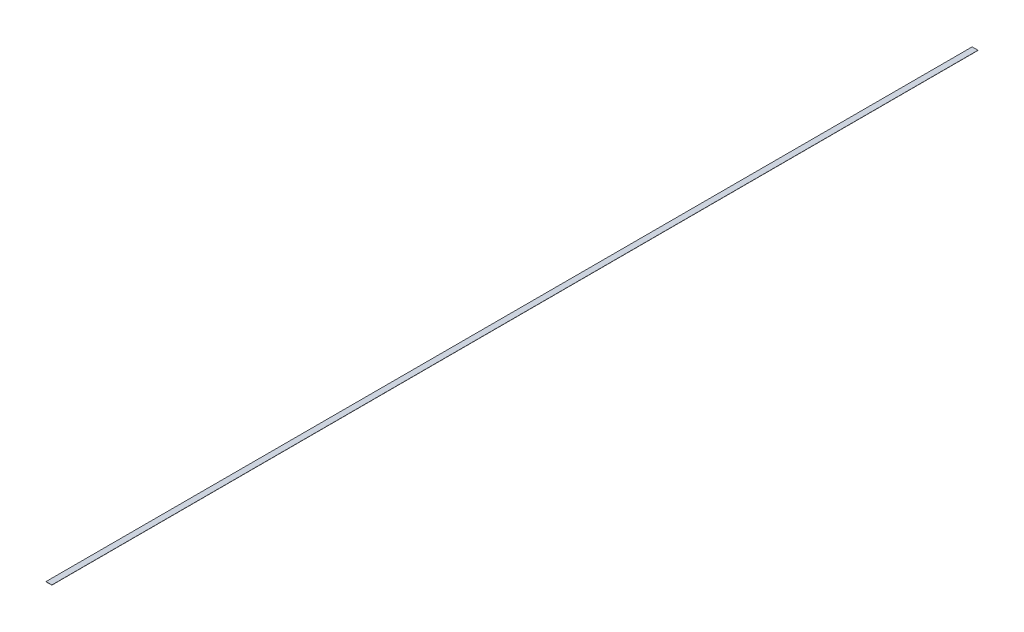
ISO-10303-21;
HEADER;
FILE_DESCRIPTION(('STEP AP214'),'2;1');
FILE_NAME('part.step','',(''),(''),'','','');
FILE_SCHEMA(('AUTOMOTIVE_DESIGN { 1 0 10303 214 1 1 1 1 }'));
ENDSEC;
DATA;
#1=APPLICATION_CONTEXT('core data for automotive mechanical design processes');
#2=APPLICATION_PROTOCOL_DEFINITION('international standard','automotive_design',2000,#1);
#3=PRODUCT_CONTEXT('',#1,'mechanical');
#4=PRODUCT('Part','Part','',(#3));
#5=PRODUCT_RELATED_PRODUCT_CATEGORY('part','',(#4));
#6=PRODUCT_DEFINITION_FORMATION('','',#4);
#7=PRODUCT_DEFINITION_CONTEXT('part definition',#1,'design');
#8=PRODUCT_DEFINITION('design','',#6,#7);
#9=PRODUCT_DEFINITION_SHAPE('','',#8);
#10=(LENGTH_UNIT() NAMED_UNIT(*) SI_UNIT(.MILLI.,.METRE.));
#11=(NAMED_UNIT(*) PLANE_ANGLE_UNIT() SI_UNIT($,.RADIAN.));
#12=(NAMED_UNIT(*) SI_UNIT($,.STERADIAN.) SOLID_ANGLE_UNIT());
#13=UNCERTAINTY_MEASURE_WITH_UNIT(LENGTH_MEASURE(1.E-05),#10,'distance_accuracy_value','');
#14=(GEOMETRIC_REPRESENTATION_CONTEXT(3) GLOBAL_UNCERTAINTY_ASSIGNED_CONTEXT((#13)) GLOBAL_UNIT_ASSIGNED_CONTEXT((#10,
#11,#12)) REPRESENTATION_CONTEXT('',''));
#15=CARTESIAN_POINT('',(0.,0.,0.));
#16=DIRECTION('',(0.,0.,1.));
#17=DIRECTION('',(1.,0.,0.));
#18=AXIS2_PLACEMENT_3D('',#15,#16,#17);
#19=CARTESIAN_POINT('',(25.4,1.5875,-4008.755));
#20=DIRECTION('',(-1.,0.,0.));
#21=DIRECTION('',(0.,0.,1.));
#22=AXIS2_PLACEMENT_3D('',#19,#20,#21);
#23=PLANE('',#22);
#24=DIRECTION('',(0.,0.,-1.));
#25=VECTOR('',#24,1.);
#26=CARTESIAN_POINT('',(25.4,0.,-4008.755));
#27=LINE('',#26,#25);
#28=CARTESIAN_POINT('',(25.4,0.,4008.755));
#29=VERTEX_POINT('',#28);
#30=CARTESIAN_POINT('',(25.4,0.,-4008.755));
#31=VERTEX_POINT('',#30);
#32=EDGE_CURVE('E97',#29,#31,#27,.T.);
#33=ORIENTED_EDGE('',*,*,#32,.T.);
#34=DIRECTION('',(0.,-1.,0.));
#35=VECTOR('',#34,1.);
#36=CARTESIAN_POINT('',(25.4,1.5875,-4008.755));
#37=LINE('',#36,#35);
#38=CARTESIAN_POINT('',(25.4,1.5875,-4008.755));
#39=VERTEX_POINT('',#38);
#40=EDGE_CURVE('E11',#39,#31,#37,.T.);
#41=ORIENTED_EDGE('',*,*,#40,.F.);
#42=DIRECTION('',(0.,0.,-1.));
#43=VECTOR('',#42,1.);
#44=CARTESIAN_POINT('',(25.4,1.5875,-4008.755));
#45=LINE('',#44,#43);
#46=CARTESIAN_POINT('',(25.4,1.5875,4008.755));
#47=VERTEX_POINT('',#46);
#48=EDGE_CURVE('E85',#47,#39,#45,.T.);
#49=ORIENTED_EDGE('',*,*,#48,.F.);
#50=DIRECTION('',(0.,-1.,0.));
#51=VECTOR('',#50,1.);
#52=CARTESIAN_POINT('',(25.4,1.5875,4008.755));
#53=LINE('',#52,#51);
#54=EDGE_CURVE('E93',#47,#29,#53,.T.);
#55=ORIENTED_EDGE('',*,*,#54,.T.);
#56=EDGE_LOOP('',(#33,#41,#49,#55));
#57=FACE_BOUND('',#56,.T.);
#58=ADVANCED_FACE('F34',(#57),#23,.F.);
#59=CARTESIAN_POINT('',(-25.4,1.5875,-4008.755));
#60=DIRECTION('',(0.,0.,1.));
#61=DIRECTION('',(1.,0.,0.));
#62=AXIS2_PLACEMENT_3D('',#59,#60,#61);
#63=PLANE('',#62);
#64=DIRECTION('',(-1.,0.,0.));
#65=VECTOR('',#64,1.);
#66=CARTESIAN_POINT('',(-25.4,0.,-4008.755));
#67=LINE('',#66,#65);
#68=CARTESIAN_POINT('',(-25.4,0.,-4008.755));
#69=VERTEX_POINT('',#68);
#70=EDGE_CURVE('E89',#31,#69,#67,.T.);
#71=ORIENTED_EDGE('',*,*,#70,.T.);
#72=DIRECTION('',(0.,-1.,0.));
#73=VECTOR('',#72,1.);
#74=CARTESIAN_POINT('',(-25.4,1.5875,-4008.755));
#75=LINE('',#74,#73);
#76=CARTESIAN_POINT('',(-25.4,1.5875,-4008.755));
#77=VERTEX_POINT('',#76);
#78=EDGE_CURVE('E42',#77,#69,#75,.T.);
#79=ORIENTED_EDGE('',*,*,#78,.F.);
#80=DIRECTION('',(-1.,0.,0.));
#81=VECTOR('',#80,1.);
#82=CARTESIAN_POINT('',(-25.4,1.5875,-4008.755));
#83=LINE('',#82,#81);
#84=EDGE_CURVE('E80',#39,#77,#83,.T.);
#85=ORIENTED_EDGE('',*,*,#84,.F.);
#86=ORIENTED_EDGE('',*,*,#40,.T.);
#87=EDGE_LOOP('',(#71,#79,#85,#86));
#88=FACE_BOUND('',#87,.T.);
#89=ADVANCED_FACE('F88',(#88),#63,.F.);
#90=CARTESIAN_POINT('',(-25.4,1.5875,-4008.755));
#91=DIRECTION('',(1.,0.,0.));
#92=DIRECTION('',(0.,0.,-1.));
#93=AXIS2_PLACEMENT_3D('',#90,#91,#92);
#94=PLANE('',#93);
#95=DIRECTION('',(0.,0.,1.));
#96=VECTOR('',#95,1.);
#97=CARTESIAN_POINT('',(-25.4,0.,-4008.755));
#98=LINE('',#97,#96);
#99=CARTESIAN_POINT('',(-25.4,0.,4008.755));
#100=VERTEX_POINT('',#99);
#101=EDGE_CURVE('E67',#69,#100,#98,.T.);
#102=ORIENTED_EDGE('',*,*,#101,.T.);
#103=DIRECTION('',(0.,-1.,0.));
#104=VECTOR('',#103,1.);
#105=CARTESIAN_POINT('',(-25.4,1.5875,4008.755));
#106=LINE('',#105,#104);
#107=CARTESIAN_POINT('',(-25.4,1.5875,4008.755));
#108=VERTEX_POINT('',#107);
#109=EDGE_CURVE('E90',#108,#100,#106,.T.);
#110=ORIENTED_EDGE('',*,*,#109,.F.);
#111=DIRECTION('',(0.,0.,1.));
#112=VECTOR('',#111,1.);
#113=CARTESIAN_POINT('',(-25.4,1.5875,-4008.755));
#114=LINE('',#113,#112);
#115=EDGE_CURVE('E83',#77,#108,#114,.T.);
#116=ORIENTED_EDGE('',*,*,#115,.F.);
#117=ORIENTED_EDGE('',*,*,#78,.T.);
#118=EDGE_LOOP('',(#102,#110,#116,#117));
#119=FACE_BOUND('',#118,.T.);
#120=ADVANCED_FACE('F91',(#119),#94,.F.);
#121=CARTESIAN_POINT('',(-25.4,1.5875,4008.755));
#122=DIRECTION('',(0.,0.,-1.));
#123=DIRECTION('',(-1.,0.,0.));
#124=AXIS2_PLACEMENT_3D('',#121,#122,#123);
#125=PLANE('',#124);
#126=DIRECTION('',(1.,0.,0.));
#127=VECTOR('',#126,1.);
#128=CARTESIAN_POINT('',(-25.4,0.,4008.755));
#129=LINE('',#128,#127);
#130=EDGE_CURVE('E73',#100,#29,#129,.T.);
#131=ORIENTED_EDGE('',*,*,#130,.T.);
#132=ORIENTED_EDGE('',*,*,#54,.F.);
#133=DIRECTION('',(1.,0.,0.));
#134=VECTOR('',#133,1.);
#135=CARTESIAN_POINT('',(-25.4,1.5875,4008.755));
#136=LINE('',#135,#134);
#137=EDGE_CURVE('E50',#108,#47,#136,.T.);
#138=ORIENTED_EDGE('',*,*,#137,.F.);
#139=ORIENTED_EDGE('',*,*,#109,.T.);
#140=EDGE_LOOP('',(#131,#132,#138,#139));
#141=FACE_BOUND('',#140,.T.);
#142=ADVANCED_FACE('F104',(#141),#125,.F.);
#143=CARTESIAN_POINT('',(0.,1.5875,0.));
#144=DIRECTION('',(0.,1.,0.));
#145=DIRECTION('',(0.,0.,1.));
#146=AXIS2_PLACEMENT_3D('',#143,#144,#145);
#147=PLANE('',#146);
#148=ORIENTED_EDGE('',*,*,#48,.T.);
#149=ORIENTED_EDGE('',*,*,#84,.T.);
#150=ORIENTED_EDGE('',*,*,#115,.T.);
#151=ORIENTED_EDGE('',*,*,#137,.T.);
#152=EDGE_LOOP('',(#148,#149,#150,#151));
#153=FACE_BOUND('',#152,.T.);
#154=ADVANCED_FACE('F81',(#153),#147,.T.);
#155=CARTESIAN_POINT('',(0.,0.,0.));
#156=DIRECTION('',(0.,1.,0.));
#157=DIRECTION('',(0.,0.,1.));
#158=AXIS2_PLACEMENT_3D('',#155,#156,#157);
#159=PLANE('',#158);
#160=ORIENTED_EDGE('',*,*,#32,.F.);
#161=ORIENTED_EDGE('',*,*,#130,.F.);
#162=ORIENTED_EDGE('',*,*,#101,.F.);
#163=ORIENTED_EDGE('',*,*,#70,.F.);
#164=EDGE_LOOP('',(#160,#161,#162,#163));
#165=FACE_BOUND('',#164,.T.);
#166=ADVANCED_FACE('F107',(#165),#159,.F.);
#167=CLOSED_SHELL('',(#58,#89,#120,#142,#154,#166));
#168=MANIFOLD_SOLID_BREP('B2',#167);
#169=ADVANCED_BREP_SHAPE_REPRESENTATION('',(#18,#168),#14);
#170=SHAPE_DEFINITION_REPRESENTATION(#9,#169);
ENDSEC;
END-ISO-10303-21;
